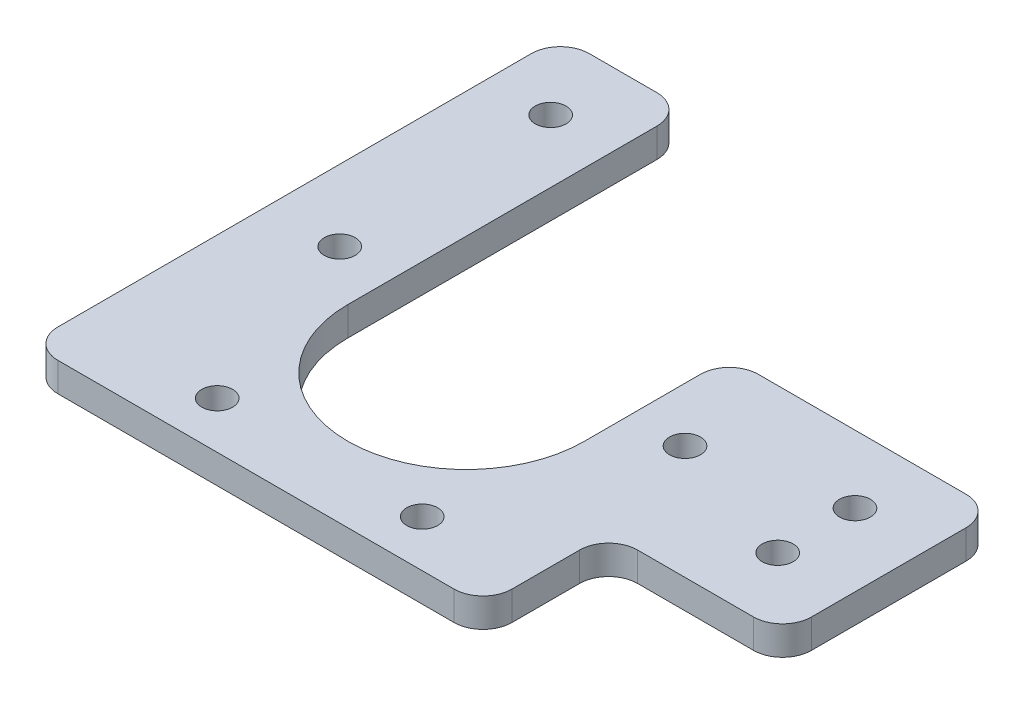
ISO-10303-21;
HEADER;
FILE_DESCRIPTION(('STEP AP214'),'2;1');
FILE_NAME('part.step','',(''),(''),'','','');
FILE_SCHEMA(('AUTOMOTIVE_DESIGN { 1 0 10303 214 1 1 1 1 }'));
ENDSEC;
DATA;
#1=APPLICATION_CONTEXT('core data for automotive mechanical design processes');
#2=APPLICATION_PROTOCOL_DEFINITION('international standard','automotive_design',2000,#1);
#3=PRODUCT_CONTEXT('',#1,'mechanical');
#4=PRODUCT('Part','Part','',(#3));
#5=PRODUCT_RELATED_PRODUCT_CATEGORY('part','',(#4));
#6=PRODUCT_DEFINITION_FORMATION('','',#4);
#7=PRODUCT_DEFINITION_CONTEXT('part definition',#1,'design');
#8=PRODUCT_DEFINITION('design','',#6,#7);
#9=PRODUCT_DEFINITION_SHAPE('','',#8);
#10=(LENGTH_UNIT() NAMED_UNIT(*) SI_UNIT(.MILLI.,.METRE.));
#11=(NAMED_UNIT(*) PLANE_ANGLE_UNIT() SI_UNIT($,.RADIAN.));
#12=(NAMED_UNIT(*) SI_UNIT($,.STERADIAN.) SOLID_ANGLE_UNIT());
#13=UNCERTAINTY_MEASURE_WITH_UNIT(LENGTH_MEASURE(1.E-05),#10,'distance_accuracy_value','');
#14=(GEOMETRIC_REPRESENTATION_CONTEXT(3) GLOBAL_UNCERTAINTY_ASSIGNED_CONTEXT((#13)) GLOBAL_UNIT_ASSIGNED_CONTEXT((#10,
#11,#12)) REPRESENTATION_CONTEXT('',''));
#15=CARTESIAN_POINT('',(0.,0.,0.));
#16=DIRECTION('',(0.,0.,1.));
#17=DIRECTION('',(1.,0.,0.));
#18=AXIS2_PLACEMENT_3D('',#15,#16,#17);
#19=CARTESIAN_POINT('',(-4.74999999999999,3.,-37.5));
#20=DIRECTION('',(0.,1.,0.));
#21=DIRECTION('',(0.,0.,1.));
#22=AXIS2_PLACEMENT_3D('',#19,#20,#21);
#23=PLANE('',#22);
#24=CARTESIAN_POINT('',(5.86116407249438,3.,-22.3456871806537));
#25=DIRECTION('',(0.,1.,0.));
#26=DIRECTION('',(0.,0.,1.));
#27=AXIS2_PLACEMENT_3D('',#24,#25,#26);
#28=CIRCLE('',#27,1.6);
#29=CARTESIAN_POINT('',(5.86116407249438,3.,-20.7456871806537));
#30=VERTEX_POINT('',#29);
#31=EDGE_CURVE('E636',#30,#30,#28,.T.);
#32=ORIENTED_EDGE('',*,*,#31,.F.);
#33=EDGE_LOOP('',(#32));
#34=FACE_BOUND('',#33,.T.);
#35=CARTESIAN_POINT('',(-15.3611640724944,3.,-22.3456871806537));
#36=DIRECTION('',(0.,1.,0.));
#37=DIRECTION('',(0.,0.,-1.));
#38=AXIS2_PLACEMENT_3D('',#35,#36,#37);
#39=CIRCLE('',#38,1.6);
#40=CARTESIAN_POINT('',(-15.3611640724944,3.,-23.9456871806537));
#41=VERTEX_POINT('',#40);
#42=EDGE_CURVE('E624',#41,#41,#39,.T.);
#43=ORIENTED_EDGE('',*,*,#42,.F.);
#44=EDGE_LOOP('',(#43));
#45=FACE_BOUND('',#44,.T.);
#46=CARTESIAN_POINT('',(27.5,3.,-45.5));
#47=DIRECTION('',(0.,1.,0.));
#48=DIRECTION('',(0.,0.,1.));
#49=AXIS2_PLACEMENT_3D('',#46,#47,#48);
#50=CIRCLE('',#49,1.6);
#51=CARTESIAN_POINT('',(27.5,3.,-43.9));
#52=VERTEX_POINT('',#51);
#53=EDGE_CURVE('E611',#52,#52,#50,.T.);
#54=ORIENTED_EDGE('',*,*,#53,.F.);
#55=EDGE_LOOP('',(#54));
#56=FACE_BOUND('',#55,.T.);
#57=DIRECTION('',(0.,0.,1.));
#58=VECTOR('',#57,1.);
#59=CARTESIAN_POINT('',(-30.,3.,-72.5));
#60=LINE('',#59,#58);
#61=CARTESIAN_POINT('',(-30.,3.,-69.5));
#62=VERTEX_POINT('',#61);
#63=CARTESIAN_POINT('',(-30.,3.,-20.5));
#64=VERTEX_POINT('',#63);
#65=EDGE_CURVE('E333',#62,#64,#60,.T.);
#66=ORIENTED_EDGE('',*,*,#65,.T.);
#67=CARTESIAN_POINT('',(-27.,3.,-20.5));
#68=DIRECTION('',(0.,1.,0.));
#69=DIRECTION('',(0.,0.,1.));
#70=AXIS2_PLACEMENT_3D('',#67,#68,#69);
#71=CIRCLE('',#70,3.);
#72=CARTESIAN_POINT('',(-27.,3.,-17.5));
#73=VERTEX_POINT('',#72);
#74=EDGE_CURVE('E232',#64,#73,#71,.T.);
#75=ORIENTED_EDGE('',*,*,#74,.T.);
#76=DIRECTION('',(1.,0.,0.));
#77=VECTOR('',#76,1.);
#78=CARTESIAN_POINT('',(-30.,3.,-17.5));
#79=LINE('',#78,#77);
#80=CARTESIAN_POINT('',(14.,3.,-17.5));
#81=VERTEX_POINT('',#80);
#82=EDGE_CURVE('E296',#73,#81,#79,.T.);
#83=ORIENTED_EDGE('',*,*,#82,.T.);
#84=CARTESIAN_POINT('',(14.,3.,-20.5));
#85=DIRECTION('',(0.,1.,0.));
#86=DIRECTION('',(0.,0.,1.));
#87=AXIS2_PLACEMENT_3D('',#84,#85,#86);
#88=CIRCLE('',#87,3.);
#89=CARTESIAN_POINT('',(17.,3.,-20.5));
#90=VERTEX_POINT('',#89);
#91=EDGE_CURVE('E230',#81,#90,#88,.T.);
#92=ORIENTED_EDGE('',*,*,#91,.T.);
#93=DIRECTION('',(0.,0.,-1.));
#94=VECTOR('',#93,1.);
#95=CARTESIAN_POINT('',(17.,3.,-17.5));
#96=LINE('',#95,#94);
#97=CARTESIAN_POINT('',(17.,3.,-27.5));
#98=VERTEX_POINT('',#97);
#99=EDGE_CURVE('E287',#90,#98,#96,.T.);
#100=ORIENTED_EDGE('',*,*,#99,.T.);
#101=CARTESIAN_POINT('',(20.,3.,-27.5));
#102=DIRECTION('',(0.,1.,0.));
#103=DIRECTION('',(0.,0.,1.));
#104=AXIS2_PLACEMENT_3D('',#101,#102,#103);
#105=CIRCLE('',#104,3.);
#106=CARTESIAN_POINT('',(20.,3.,-30.5));
#107=VERTEX_POINT('',#106);
#108=EDGE_CURVE('E11',#98,#107,#105,.F.);
#109=ORIENTED_EDGE('',*,*,#108,.T.);
#110=DIRECTION('',(1.,0.,0.));
#111=VECTOR('',#110,1.);
#112=CARTESIAN_POINT('',(17.,3.,-30.5));
#113=LINE('',#112,#111);
#114=CARTESIAN_POINT('',(32.,3.,-30.5));
#115=VERTEX_POINT('',#114);
#116=EDGE_CURVE('E285',#107,#115,#113,.T.);
#117=ORIENTED_EDGE('',*,*,#116,.T.);
#118=CARTESIAN_POINT('',(32.,3.,-33.5));
#119=DIRECTION('',(0.,1.,0.));
#120=DIRECTION('',(0.,0.,1.));
#121=AXIS2_PLACEMENT_3D('',#118,#119,#120);
#122=CIRCLE('',#121,3.);
#123=CARTESIAN_POINT('',(35.,3.,-33.5));
#124=VERTEX_POINT('',#123);
#125=EDGE_CURVE('E228',#115,#124,#122,.T.);
#126=ORIENTED_EDGE('',*,*,#125,.T.);
#127=DIRECTION('',(0.,0.,-1.));
#128=VECTOR('',#127,1.);
#129=CARTESIAN_POINT('',(35.,3.,-30.5));
#130=LINE('',#129,#128);
#131=CARTESIAN_POINT('',(35.,3.,-49.5));
#132=VERTEX_POINT('',#131);
#133=EDGE_CURVE('E291',#124,#132,#130,.T.);
#134=ORIENTED_EDGE('',*,*,#133,.T.);
#135=CARTESIAN_POINT('',(32.,3.,-49.5));
#136=DIRECTION('',(0.,1.,0.));
#137=DIRECTION('',(0.,0.,1.));
#138=AXIS2_PLACEMENT_3D('',#135,#136,#137);
#139=CIRCLE('',#138,3.);
#140=CARTESIAN_POINT('',(32.,3.,-52.5));
#141=VERTEX_POINT('',#140);
#142=EDGE_CURVE('E226',#132,#141,#139,.T.);
#143=ORIENTED_EDGE('',*,*,#142,.T.);
#144=DIRECTION('',(-1.,0.,0.));
#145=VECTOR('',#144,1.);
#146=CARTESIAN_POINT('',(35.,3.,-52.5));
#147=LINE('',#146,#145);
#148=CARTESIAN_POINT('',(10.5,3.,-52.5));
#149=VERTEX_POINT('',#148);
#150=EDGE_CURVE('E294',#141,#149,#147,.T.);
#151=ORIENTED_EDGE('',*,*,#150,.T.);
#152=CARTESIAN_POINT('',(10.5,3.,-49.5));
#153=DIRECTION('',(0.,1.,0.));
#154=DIRECTION('',(0.,0.,1.));
#155=AXIS2_PLACEMENT_3D('',#152,#153,#154);
#156=CIRCLE('',#155,3.);
#157=CARTESIAN_POINT('',(7.50000000000001,3.,-49.5));
#158=VERTEX_POINT('',#157);
#159=EDGE_CURVE('E56',#149,#158,#156,.T.);
#160=ORIENTED_EDGE('',*,*,#159,.T.);
#161=DIRECTION('',(0.,0.,1.));
#162=VECTOR('',#161,1.);
#163=CARTESIAN_POINT('',(7.50000000000001,3.,-52.5));
#164=LINE('',#163,#162);
#165=CARTESIAN_POINT('',(7.50000000000001,3.,-37.5));
#166=VERTEX_POINT('',#165);
#167=EDGE_CURVE('E183',#158,#166,#164,.T.);
#168=ORIENTED_EDGE('',*,*,#167,.T.);
#169=CARTESIAN_POINT('',(-4.74999999999999,3.,-37.5));
#170=DIRECTION('',(0.,-1.,0.));
#171=DIRECTION('',(0.,0.,1.));
#172=AXIS2_PLACEMENT_3D('',#169,#170,#171);
#173=CIRCLE('',#172,12.25);
#174=CARTESIAN_POINT('',(-17.,3.,-37.5));
#175=VERTEX_POINT('',#174);
#176=EDGE_CURVE('E178',#166,#175,#173,.T.);
#177=ORIENTED_EDGE('',*,*,#176,.T.);
#178=DIRECTION('',(0.,0.,-1.));
#179=VECTOR('',#178,1.);
#180=CARTESIAN_POINT('',(-17.,3.,-57.5));
#181=LINE('',#180,#179);
#182=CARTESIAN_POINT('',(-17.,3.,-69.5));
#183=VERTEX_POINT('',#182);
#184=EDGE_CURVE('E167',#175,#183,#181,.T.);
#185=ORIENTED_EDGE('',*,*,#184,.T.);
#186=CARTESIAN_POINT('',(-20.,3.,-69.5));
#187=DIRECTION('',(0.,1.,0.));
#188=DIRECTION('',(0.,0.,1.));
#189=AXIS2_PLACEMENT_3D('',#186,#187,#188);
#190=CIRCLE('',#189,3.);
#191=CARTESIAN_POINT('',(-20.,3.,-72.5));
#192=VERTEX_POINT('',#191);
#193=EDGE_CURVE('E223',#183,#192,#190,.T.);
#194=ORIENTED_EDGE('',*,*,#193,.T.);
#195=DIRECTION('',(-1.,0.,0.));
#196=VECTOR('',#195,1.);
#197=CARTESIAN_POINT('',(-17.,3.,-72.5));
#198=LINE('',#197,#196);
#199=CARTESIAN_POINT('',(-27.,3.,-72.5));
#200=VERTEX_POINT('',#199);
#201=EDGE_CURVE('E177',#192,#200,#198,.T.);
#202=ORIENTED_EDGE('',*,*,#201,.T.);
#203=CARTESIAN_POINT('',(-27.,3.,-69.5));
#204=DIRECTION('',(0.,1.,0.));
#205=DIRECTION('',(0.,0.,1.));
#206=AXIS2_PLACEMENT_3D('',#203,#204,#205);
#207=CIRCLE('',#206,3.);
#208=EDGE_CURVE('E221',#200,#62,#207,.T.);
#209=ORIENTED_EDGE('',*,*,#208,.T.);
#210=EDGE_LOOP('',(#66,#75,#83,#92,#100,#109,#117,#126,#134,#143,#151,#160,#168,#177,#185,#194,
#202,#209));
#211=FACE_BOUND('',#210,.T.);
#212=CARTESIAN_POINT('',(-23.5,3.,-65.));
#213=DIRECTION('',(0.,1.,0.));
#214=DIRECTION('',(0.,0.,1.));
#215=AXIS2_PLACEMENT_3D('',#212,#213,#214);
#216=CIRCLE('',#215,1.6);
#217=CARTESIAN_POINT('',(-23.5,3.,-63.4));
#218=VERTEX_POINT('',#217);
#219=EDGE_CURVE('E304',#218,#218,#216,.T.);
#220=ORIENTED_EDGE('',*,*,#219,.F.);
#221=EDGE_LOOP('',(#220));
#222=FACE_BOUND('',#221,.T.);
#223=CARTESIAN_POINT('',(27.5,3.,-37.5));
#224=DIRECTION('',(0.,1.,0.));
#225=DIRECTION('',(0.,0.,1.));
#226=AXIS2_PLACEMENT_3D('',#223,#224,#225);
#227=CIRCLE('',#226,1.6);
#228=CARTESIAN_POINT('',(27.5,3.,-35.9));
#229=VERTEX_POINT('',#228);
#230=EDGE_CURVE('E619',#229,#229,#227,.T.);
#231=ORIENTED_EDGE('',*,*,#230,.F.);
#232=EDGE_LOOP('',(#231));
#233=FACE_BOUND('',#232,.T.);
#234=CARTESIAN_POINT('',(-22.6196277863477,3.,-42.2881523343967));
#235=DIRECTION('',(0.,1.,0.));
#236=DIRECTION('',(0.,0.,1.));
#237=AXIS2_PLACEMENT_3D('',#234,#235,#236);
#238=CIRCLE('',#237,1.6);
#239=CARTESIAN_POINT('',(-22.6196277863477,3.,-40.6881523343967));
#240=VERTEX_POINT('',#239);
#241=EDGE_CURVE('E630',#240,#240,#238,.T.);
#242=ORIENTED_EDGE('',*,*,#241,.F.);
#243=EDGE_LOOP('',(#242));
#244=FACE_BOUND('',#243,.T.);
#245=CARTESIAN_POINT('',(13.1196277863477,3.,-42.2881523343967));
#246=DIRECTION('',(0.,1.,0.));
#247=DIRECTION('',(0.,0.,-1.));
#248=AXIS2_PLACEMENT_3D('',#245,#246,#247);
#249=CIRCLE('',#248,1.6);
#250=CARTESIAN_POINT('',(13.1196277863477,3.,-43.8881523343967));
#251=VERTEX_POINT('',#250);
#252=EDGE_CURVE('E642',#251,#251,#249,.T.);
#253=ORIENTED_EDGE('',*,*,#252,.F.);
#254=EDGE_LOOP('',(#253));
#255=FACE_BOUND('',#254,.T.);
#256=ADVANCED_FACE('F41',(#34,#45,#56,#211,#222,#233,#244,#255),#23,.T.);
#257=CARTESIAN_POINT('',(-4.74999999999999,0.,-37.5));
#258=DIRECTION('',(0.,1.,0.));
#259=DIRECTION('',(0.,0.,1.));
#260=AXIS2_PLACEMENT_3D('',#257,#258,#259);
#261=PLANE('',#260);
#262=DIRECTION('',(1.,0.,0.));
#263=VECTOR('',#262,1.);
#264=CARTESIAN_POINT('',(-30.,0.,-17.5));
#265=LINE('',#264,#263);
#266=CARTESIAN_POINT('',(-27.,0.,-17.5));
#267=VERTEX_POINT('',#266);
#268=CARTESIAN_POINT('',(14.,0.,-17.5));
#269=VERTEX_POINT('',#268);
#270=EDGE_CURVE('E279',#267,#269,#265,.T.);
#271=ORIENTED_EDGE('',*,*,#270,.F.);
#272=CARTESIAN_POINT('',(-27.,0.,-20.5));
#273=DIRECTION('',(0.,1.,0.));
#274=DIRECTION('',(0.,0.,1.));
#275=AXIS2_PLACEMENT_3D('',#272,#273,#274);
#276=CIRCLE('',#275,3.);
#277=CARTESIAN_POINT('',(-30.,0.,-20.5));
#278=VERTEX_POINT('',#277);
#279=EDGE_CURVE('E214',#267,#278,#276,.F.);
#280=ORIENTED_EDGE('',*,*,#279,.T.);
#281=DIRECTION('',(0.,0.,1.));
#282=VECTOR('',#281,1.);
#283=CARTESIAN_POINT('',(-30.,0.,-72.5));
#284=LINE('',#283,#282);
#285=CARTESIAN_POINT('',(-30.,0.,-69.5));
#286=VERTEX_POINT('',#285);
#287=EDGE_CURVE('E309',#286,#278,#284,.T.);
#288=ORIENTED_EDGE('',*,*,#287,.F.);
#289=CARTESIAN_POINT('',(-27.,0.,-69.5));
#290=DIRECTION('',(0.,1.,0.));
#291=DIRECTION('',(0.,0.,1.));
#292=AXIS2_PLACEMENT_3D('',#289,#290,#291);
#293=CIRCLE('',#292,3.);
#294=CARTESIAN_POINT('',(-27.,0.,-72.5));
#295=VERTEX_POINT('',#294);
#296=EDGE_CURVE('E202',#286,#295,#293,.F.);
#297=ORIENTED_EDGE('',*,*,#296,.T.);
#298=DIRECTION('',(-1.,0.,0.));
#299=VECTOR('',#298,1.);
#300=CARTESIAN_POINT('',(-17.,0.,-72.5));
#301=LINE('',#300,#299);
#302=CARTESIAN_POINT('',(-20.,0.,-72.5));
#303=VERTEX_POINT('',#302);
#304=EDGE_CURVE('E306',#303,#295,#301,.T.);
#305=ORIENTED_EDGE('',*,*,#304,.F.);
#306=CARTESIAN_POINT('',(-20.,0.,-69.5));
#307=DIRECTION('',(0.,1.,0.));
#308=DIRECTION('',(0.,0.,1.));
#309=AXIS2_PLACEMENT_3D('',#306,#307,#308);
#310=CIRCLE('',#309,3.);
#311=CARTESIAN_POINT('',(-17.,0.,-69.5));
#312=VERTEX_POINT('',#311);
#313=EDGE_CURVE('E204',#303,#312,#310,.F.);
#314=ORIENTED_EDGE('',*,*,#313,.T.);
#315=DIRECTION('',(0.,0.,-1.));
#316=VECTOR('',#315,1.);
#317=CARTESIAN_POINT('',(-17.,0.,-57.5));
#318=LINE('',#317,#316);
#319=CARTESIAN_POINT('',(-17.,0.,-37.5));
#320=VERTEX_POINT('',#319);
#321=EDGE_CURVE('E303',#320,#312,#318,.T.);
#322=ORIENTED_EDGE('',*,*,#321,.F.);
#323=CARTESIAN_POINT('',(-4.74999999999999,0.,-37.5));
#324=DIRECTION('',(0.,-1.,0.));
#325=DIRECTION('',(0.,0.,1.));
#326=AXIS2_PLACEMENT_3D('',#323,#324,#325);
#327=CIRCLE('',#326,12.25);
#328=CARTESIAN_POINT('',(7.50000000000001,0.,-37.5));
#329=VERTEX_POINT('',#328);
#330=EDGE_CURVE('E191',#329,#320,#327,.T.);
#331=ORIENTED_EDGE('',*,*,#330,.F.);
#332=DIRECTION('',(0.,0.,1.));
#333=VECTOR('',#332,1.);
#334=CARTESIAN_POINT('',(7.50000000000001,0.,-52.5));
#335=LINE('',#334,#333);
#336=CARTESIAN_POINT('',(7.50000000000001,0.,-49.5));
#337=VERTEX_POINT('',#336);
#338=EDGE_CURVE('E187',#337,#329,#335,.T.);
#339=ORIENTED_EDGE('',*,*,#338,.F.);
#340=CARTESIAN_POINT('',(10.5,0.,-49.5));
#341=DIRECTION('',(0.,1.,0.));
#342=DIRECTION('',(0.,0.,1.));
#343=AXIS2_PLACEMENT_3D('',#340,#341,#342);
#344=CIRCLE('',#343,3.);
#345=CARTESIAN_POINT('',(10.5,0.,-52.5));
#346=VERTEX_POINT('',#345);
#347=EDGE_CURVE('E206',#337,#346,#344,.F.);
#348=ORIENTED_EDGE('',*,*,#347,.T.);
#349=DIRECTION('',(-1.,0.,0.));
#350=VECTOR('',#349,1.);
#351=CARTESIAN_POINT('',(35.,0.,-52.5));
#352=LINE('',#351,#350);
#353=CARTESIAN_POINT('',(32.,0.,-52.5));
#354=VERTEX_POINT('',#353);
#355=EDGE_CURVE('E318',#354,#346,#352,.T.);
#356=ORIENTED_EDGE('',*,*,#355,.F.);
#357=CARTESIAN_POINT('',(32.,0.,-49.5));
#358=DIRECTION('',(0.,1.,0.));
#359=DIRECTION('',(0.,0.,1.));
#360=AXIS2_PLACEMENT_3D('',#357,#358,#359);
#361=CIRCLE('',#360,3.);
#362=CARTESIAN_POINT('',(35.,0.,-49.5));
#363=VERTEX_POINT('',#362);
#364=EDGE_CURVE('E208',#354,#363,#361,.F.);
#365=ORIENTED_EDGE('',*,*,#364,.T.);
#366=DIRECTION('',(0.,0.,-1.));
#367=VECTOR('',#366,1.);
#368=CARTESIAN_POINT('',(35.,0.,-30.5));
#369=LINE('',#368,#367);
#370=CARTESIAN_POINT('',(35.,0.,-33.5));
#371=VERTEX_POINT('',#370);
#372=EDGE_CURVE('E315',#371,#363,#369,.T.);
#373=ORIENTED_EDGE('',*,*,#372,.F.);
#374=CARTESIAN_POINT('',(32.,0.,-33.5));
#375=DIRECTION('',(0.,1.,0.));
#376=DIRECTION('',(0.,0.,1.));
#377=AXIS2_PLACEMENT_3D('',#374,#375,#376);
#378=CIRCLE('',#377,3.);
#379=CARTESIAN_POINT('',(32.,0.,-30.5));
#380=VERTEX_POINT('',#379);
#381=EDGE_CURVE('E210',#371,#380,#378,.F.);
#382=ORIENTED_EDGE('',*,*,#381,.T.);
#383=DIRECTION('',(1.,0.,0.));
#384=VECTOR('',#383,1.);
#385=CARTESIAN_POINT('',(17.,0.,-30.5));
#386=LINE('',#385,#384);
#387=CARTESIAN_POINT('',(20.,0.,-30.5));
#388=VERTEX_POINT('',#387);
#389=EDGE_CURVE('E270',#388,#380,#386,.T.);
#390=ORIENTED_EDGE('',*,*,#389,.F.);
#391=CARTESIAN_POINT('',(20.,0.,-27.5));
#392=DIRECTION('',(0.,1.,0.));
#393=DIRECTION('',(0.,0.,1.));
#394=AXIS2_PLACEMENT_3D('',#391,#392,#393);
#395=CIRCLE('',#394,3.);
#396=CARTESIAN_POINT('',(17.,0.,-27.5));
#397=VERTEX_POINT('',#396);
#398=EDGE_CURVE('E49',#388,#397,#395,.T.);
#399=ORIENTED_EDGE('',*,*,#398,.T.);
#400=DIRECTION('',(0.,0.,-1.));
#401=VECTOR('',#400,1.);
#402=CARTESIAN_POINT('',(17.,0.,-17.5));
#403=LINE('',#402,#401);
#404=CARTESIAN_POINT('',(17.,0.,-20.5));
#405=VERTEX_POINT('',#404);
#406=EDGE_CURVE('E268',#405,#397,#403,.T.);
#407=ORIENTED_EDGE('',*,*,#406,.F.);
#408=CARTESIAN_POINT('',(14.,0.,-20.5));
#409=DIRECTION('',(0.,1.,0.));
#410=DIRECTION('',(0.,0.,1.));
#411=AXIS2_PLACEMENT_3D('',#408,#409,#410);
#412=CIRCLE('',#411,3.);
#413=EDGE_CURVE('E212',#405,#269,#412,.F.);
#414=ORIENTED_EDGE('',*,*,#413,.T.);
#415=EDGE_LOOP('',(#271,#280,#288,#297,#305,#314,#322,#331,#339,#348,#356,#365,#373,#382,#390,
#399,#407,#414));
#416=FACE_BOUND('',#415,.T.);
#417=CARTESIAN_POINT('',(-23.5,0.,-65.));
#418=DIRECTION('',(0.,1.,0.));
#419=DIRECTION('',(0.,0.,1.));
#420=AXIS2_PLACEMENT_3D('',#417,#418,#419);
#421=CIRCLE('',#420,1.6);
#422=CARTESIAN_POINT('',(-23.5,0.,-63.4));
#423=VERTEX_POINT('',#422);
#424=EDGE_CURVE('E610',#423,#423,#421,.T.);
#425=ORIENTED_EDGE('',*,*,#424,.T.);
#426=EDGE_LOOP('',(#425));
#427=FACE_BOUND('',#426,.T.);
#428=CARTESIAN_POINT('',(27.5,0.,-45.5));
#429=DIRECTION('',(0.,1.,0.));
#430=DIRECTION('',(0.,0.,1.));
#431=AXIS2_PLACEMENT_3D('',#428,#429,#430);
#432=CIRCLE('',#431,1.6);
#433=CARTESIAN_POINT('',(27.5,0.,-43.9));
#434=VERTEX_POINT('',#433);
#435=EDGE_CURVE('E615',#434,#434,#432,.T.);
#436=ORIENTED_EDGE('',*,*,#435,.T.);
#437=EDGE_LOOP('',(#436));
#438=FACE_BOUND('',#437,.T.);
#439=CARTESIAN_POINT('',(27.5,0.,-37.5));
#440=DIRECTION('',(0.,1.,0.));
#441=DIRECTION('',(0.,0.,1.));
#442=AXIS2_PLACEMENT_3D('',#439,#440,#441);
#443=CIRCLE('',#442,1.6);
#444=CARTESIAN_POINT('',(27.5,0.,-35.9));
#445=VERTEX_POINT('',#444);
#446=EDGE_CURVE('E621',#445,#445,#443,.T.);
#447=ORIENTED_EDGE('',*,*,#446,.T.);
#448=EDGE_LOOP('',(#447));
#449=FACE_BOUND('',#448,.T.);
#450=CARTESIAN_POINT('',(-15.3611640724944,0.,-22.3456871806537));
#451=DIRECTION('',(0.,1.,0.));
#452=DIRECTION('',(0.,0.,-1.));
#453=AXIS2_PLACEMENT_3D('',#450,#451,#452);
#454=CIRCLE('',#453,1.6);
#455=CARTESIAN_POINT('',(-15.3611640724944,0.,-23.9456871806537));
#456=VERTEX_POINT('',#455);
#457=EDGE_CURVE('E627',#456,#456,#454,.T.);
#458=ORIENTED_EDGE('',*,*,#457,.T.);
#459=EDGE_LOOP('',(#458));
#460=FACE_BOUND('',#459,.T.);
#461=CARTESIAN_POINT('',(-22.6196277863477,0.,-42.2881523343967));
#462=DIRECTION('',(0.,1.,0.));
#463=DIRECTION('',(0.,0.,1.));
#464=AXIS2_PLACEMENT_3D('',#461,#462,#463);
#465=CIRCLE('',#464,1.6);
#466=CARTESIAN_POINT('',(-22.6196277863477,0.,-40.6881523343967));
#467=VERTEX_POINT('',#466);
#468=EDGE_CURVE('E633',#467,#467,#465,.T.);
#469=ORIENTED_EDGE('',*,*,#468,.T.);
#470=EDGE_LOOP('',(#469));
#471=FACE_BOUND('',#470,.T.);
#472=CARTESIAN_POINT('',(5.86116407249438,0.,-22.3456871806537));
#473=DIRECTION('',(0.,1.,0.));
#474=DIRECTION('',(0.,0.,1.));
#475=AXIS2_PLACEMENT_3D('',#472,#473,#474);
#476=CIRCLE('',#475,1.6);
#477=CARTESIAN_POINT('',(5.86116407249438,0.,-20.7456871806537));
#478=VERTEX_POINT('',#477);
#479=EDGE_CURVE('E639',#478,#478,#476,.T.);
#480=ORIENTED_EDGE('',*,*,#479,.T.);
#481=EDGE_LOOP('',(#480));
#482=FACE_BOUND('',#481,.T.);
#483=CARTESIAN_POINT('',(13.1196277863477,0.,-42.2881523343967));
#484=DIRECTION('',(0.,1.,0.));
#485=DIRECTION('',(0.,0.,-1.));
#486=AXIS2_PLACEMENT_3D('',#483,#484,#485);
#487=CIRCLE('',#486,1.6);
#488=CARTESIAN_POINT('',(13.1196277863477,0.,-43.8881523343967));
#489=VERTEX_POINT('',#488);
#490=EDGE_CURVE('E645',#489,#489,#487,.T.);
#491=ORIENTED_EDGE('',*,*,#490,.T.);
#492=EDGE_LOOP('',(#491));
#493=FACE_BOUND('',#492,.T.);
#494=ADVANCED_FACE('F266',(#416,#427,#438,#449,#460,#471,#482,#493),#261,.F.);
#495=CARTESIAN_POINT('',(-4.74999999999999,3.,-37.5));
#496=DIRECTION('',(0.,-1.,0.));
#497=DIRECTION('',(0.,0.,-1.));
#498=AXIS2_PLACEMENT_3D('',#495,#496,#497);
#499=CYLINDRICAL_SURFACE('',#498,12.25);
#500=ORIENTED_EDGE('',*,*,#330,.T.);
#501=DIRECTION('',(0.,-1.,0.));
#502=VECTOR('',#501,1.);
#503=CARTESIAN_POINT('',(-17.,3.,-37.5));
#504=LINE('',#503,#502);
#505=EDGE_CURVE('E172',#175,#320,#504,.T.);
#506=ORIENTED_EDGE('',*,*,#505,.F.);
#507=ORIENTED_EDGE('',*,*,#176,.F.);
#508=DIRECTION('',(0.,-1.,0.));
#509=VECTOR('',#508,1.);
#510=CARTESIAN_POINT('',(7.50000000000001,3.,-37.5));
#511=LINE('',#510,#509);
#512=EDGE_CURVE('E193',#166,#329,#511,.T.);
#513=ORIENTED_EDGE('',*,*,#512,.T.);
#514=EDGE_LOOP('',(#500,#506,#507,#513));
#515=FACE_BOUND('',#514,.T.);
#516=ADVANCED_FACE('F189',(#515),#499,.F.);
#517=CARTESIAN_POINT('',(-17.,3.,-57.5));
#518=DIRECTION('',(-1.,0.,0.));
#519=DIRECTION('',(0.,0.,1.));
#520=AXIS2_PLACEMENT_3D('',#517,#518,#519);
#521=PLANE('',#520);
#522=ORIENTED_EDGE('',*,*,#321,.T.);
#523=DIRECTION('',(0.,-1.,0.));
#524=VECTOR('',#523,1.);
#525=CARTESIAN_POINT('',(-17.,3.,-69.5));
#526=LINE('',#525,#524);
#527=EDGE_CURVE('E175',#312,#183,#526,.F.);
#528=ORIENTED_EDGE('',*,*,#527,.T.);
#529=ORIENTED_EDGE('',*,*,#184,.F.);
#530=ORIENTED_EDGE('',*,*,#505,.T.);
#531=EDGE_LOOP('',(#522,#528,#529,#530));
#532=FACE_BOUND('',#531,.T.);
#533=ADVANCED_FACE('F170',(#532),#521,.F.);
#534=CARTESIAN_POINT('',(-17.,3.,-72.5));
#535=DIRECTION('',(0.,0.,1.));
#536=DIRECTION('',(1.,0.,0.));
#537=AXIS2_PLACEMENT_3D('',#534,#535,#536);
#538=PLANE('',#537);
#539=ORIENTED_EDGE('',*,*,#201,.F.);
#540=DIRECTION('',(0.,-1.,0.));
#541=VECTOR('',#540,1.);
#542=CARTESIAN_POINT('',(-20.,3.,-72.5));
#543=LINE('',#542,#541);
#544=EDGE_CURVE('E258',#192,#303,#543,.T.);
#545=ORIENTED_EDGE('',*,*,#544,.T.);
#546=ORIENTED_EDGE('',*,*,#304,.T.);
#547=DIRECTION('',(0.,-1.,0.));
#548=VECTOR('',#547,1.);
#549=CARTESIAN_POINT('',(-27.,3.,-72.5));
#550=LINE('',#549,#548);
#551=EDGE_CURVE('E256',#295,#200,#550,.F.);
#552=ORIENTED_EDGE('',*,*,#551,.T.);
#553=EDGE_LOOP('',(#539,#545,#546,#552));
#554=FACE_BOUND('',#553,.T.);
#555=ADVANCED_FACE('F331',(#554),#538,.F.);
#556=CARTESIAN_POINT('',(-30.,3.,-72.5));
#557=DIRECTION('',(1.,0.,0.));
#558=DIRECTION('',(0.,0.,-1.));
#559=AXIS2_PLACEMENT_3D('',#556,#557,#558);
#560=PLANE('',#559);
#561=ORIENTED_EDGE('',*,*,#287,.T.);
#562=DIRECTION('',(0.,-1.,0.));
#563=VECTOR('',#562,1.);
#564=CARTESIAN_POINT('',(-30.,3.,-20.5));
#565=LINE('',#564,#563);
#566=EDGE_CURVE('E219',#278,#64,#565,.F.);
#567=ORIENTED_EDGE('',*,*,#566,.T.);
#568=ORIENTED_EDGE('',*,*,#65,.F.);
#569=DIRECTION('',(0.,-1.,0.));
#570=VECTOR('',#569,1.);
#571=CARTESIAN_POINT('',(-30.,3.,-69.5));
#572=LINE('',#571,#570);
#573=EDGE_CURVE('E216',#62,#286,#572,.T.);
#574=ORIENTED_EDGE('',*,*,#573,.T.);
#575=EDGE_LOOP('',(#561,#567,#568,#574));
#576=FACE_BOUND('',#575,.T.);
#577=ADVANCED_FACE('F351',(#576),#560,.F.);
#578=CARTESIAN_POINT('',(-30.,3.,-17.5));
#579=DIRECTION('',(0.,0.,-1.));
#580=DIRECTION('',(-1.,0.,0.));
#581=AXIS2_PLACEMENT_3D('',#578,#579,#580);
#582=PLANE('',#581);
#583=ORIENTED_EDGE('',*,*,#82,.F.);
#584=DIRECTION('',(0.,-1.,0.));
#585=VECTOR('',#584,1.);
#586=CARTESIAN_POINT('',(-27.,3.,-17.5));
#587=LINE('',#586,#585);
#588=EDGE_CURVE('E195',#73,#267,#587,.T.);
#589=ORIENTED_EDGE('',*,*,#588,.T.);
#590=ORIENTED_EDGE('',*,*,#270,.T.);
#591=DIRECTION('',(0.,-1.,0.));
#592=VECTOR('',#591,1.);
#593=CARTESIAN_POINT('',(14.,3.,-17.5));
#594=LINE('',#593,#592);
#595=EDGE_CURVE('E192',#269,#81,#594,.F.);
#596=ORIENTED_EDGE('',*,*,#595,.T.);
#597=EDGE_LOOP('',(#583,#589,#590,#596));
#598=FACE_BOUND('',#597,.T.);
#599=ADVANCED_FACE('F345',(#598),#582,.F.);
#600=CARTESIAN_POINT('',(17.,3.,-17.5));
#601=DIRECTION('',(-1.,0.,0.));
#602=DIRECTION('',(0.,0.,1.));
#603=AXIS2_PLACEMENT_3D('',#600,#601,#602);
#604=PLANE('',#603);
#605=ORIENTED_EDGE('',*,*,#99,.F.);
#606=DIRECTION('',(0.,-1.,0.));
#607=VECTOR('',#606,1.);
#608=CARTESIAN_POINT('',(17.,3.,-20.5));
#609=LINE('',#608,#607);
#610=EDGE_CURVE('E236',#90,#405,#609,.T.);
#611=ORIENTED_EDGE('',*,*,#610,.T.);
#612=ORIENTED_EDGE('',*,*,#406,.T.);
#613=DIRECTION('',(0.,-1.,0.));
#614=VECTOR('',#613,1.);
#615=CARTESIAN_POINT('',(17.,3.,-27.5));
#616=LINE('',#615,#614);
#617=EDGE_CURVE('E234',#397,#98,#616,.F.);
#618=ORIENTED_EDGE('',*,*,#617,.T.);
#619=EDGE_LOOP('',(#605,#611,#612,#618));
#620=FACE_BOUND('',#619,.T.);
#621=ADVANCED_FACE('F276',(#620),#604,.F.);
#622=CARTESIAN_POINT('',(17.,3.,-30.5));
#623=DIRECTION('',(0.,0.,-1.));
#624=DIRECTION('',(-1.,0.,0.));
#625=AXIS2_PLACEMENT_3D('',#622,#623,#624);
#626=PLANE('',#625);
#627=ORIENTED_EDGE('',*,*,#116,.F.);
#628=DIRECTION('',(0.,-1.,0.));
#629=VECTOR('',#628,1.);
#630=CARTESIAN_POINT('',(20.,0.,-30.5));
#631=LINE('',#630,#629);
#632=EDGE_CURVE('E241',#107,#388,#631,.T.);
#633=ORIENTED_EDGE('',*,*,#632,.T.);
#634=ORIENTED_EDGE('',*,*,#389,.T.);
#635=DIRECTION('',(0.,-1.,0.));
#636=VECTOR('',#635,1.);
#637=CARTESIAN_POINT('',(32.,3.,-30.5));
#638=LINE('',#637,#636);
#639=EDGE_CURVE('E239',#380,#115,#638,.F.);
#640=ORIENTED_EDGE('',*,*,#639,.T.);
#641=EDGE_LOOP('',(#627,#633,#634,#640));
#642=FACE_BOUND('',#641,.T.);
#643=ADVANCED_FACE('F289',(#642),#626,.F.);
#644=CARTESIAN_POINT('',(35.,3.,-30.5));
#645=DIRECTION('',(-1.,0.,0.));
#646=DIRECTION('',(0.,0.,1.));
#647=AXIS2_PLACEMENT_3D('',#644,#645,#646);
#648=PLANE('',#647);
#649=ORIENTED_EDGE('',*,*,#133,.F.);
#650=DIRECTION('',(0.,-1.,0.));
#651=VECTOR('',#650,1.);
#652=CARTESIAN_POINT('',(35.,3.,-33.5));
#653=LINE('',#652,#651);
#654=EDGE_CURVE('E246',#124,#371,#653,.T.);
#655=ORIENTED_EDGE('',*,*,#654,.T.);
#656=ORIENTED_EDGE('',*,*,#372,.T.);
#657=DIRECTION('',(0.,-1.,0.));
#658=VECTOR('',#657,1.);
#659=CARTESIAN_POINT('',(35.,3.,-49.5));
#660=LINE('',#659,#658);
#661=EDGE_CURVE('E244',#363,#132,#660,.F.);
#662=ORIENTED_EDGE('',*,*,#661,.T.);
#663=EDGE_LOOP('',(#649,#655,#656,#662));
#664=FACE_BOUND('',#663,.T.);
#665=ADVANCED_FACE('F379',(#664),#648,.F.);
#666=CARTESIAN_POINT('',(35.,3.,-52.5));
#667=DIRECTION('',(0.,0.,1.));
#668=DIRECTION('',(1.,0.,0.));
#669=AXIS2_PLACEMENT_3D('',#666,#667,#668);
#670=PLANE('',#669);
#671=ORIENTED_EDGE('',*,*,#150,.F.);
#672=DIRECTION('',(0.,-1.,0.));
#673=VECTOR('',#672,1.);
#674=CARTESIAN_POINT('',(32.,3.,-52.5));
#675=LINE('',#674,#673);
#676=EDGE_CURVE('E250',#141,#354,#675,.T.);
#677=ORIENTED_EDGE('',*,*,#676,.T.);
#678=ORIENTED_EDGE('',*,*,#355,.T.);
#679=DIRECTION('',(0.,-1.,0.));
#680=VECTOR('',#679,1.);
#681=CARTESIAN_POINT('',(10.5,3.,-52.5));
#682=LINE('',#681,#680);
#683=EDGE_CURVE('E64',#346,#149,#682,.F.);
#684=ORIENTED_EDGE('',*,*,#683,.T.);
#685=EDGE_LOOP('',(#671,#677,#678,#684));
#686=FACE_BOUND('',#685,.T.);
#687=ADVANCED_FACE('F376',(#686),#670,.F.);
#688=CARTESIAN_POINT('',(7.50000000000001,3.,-52.5));
#689=DIRECTION('',(1.,0.,0.));
#690=DIRECTION('',(0.,0.,-1.));
#691=AXIS2_PLACEMENT_3D('',#688,#689,#690);
#692=PLANE('',#691);
#693=ORIENTED_EDGE('',*,*,#167,.F.);
#694=DIRECTION('',(0.,-1.,0.));
#695=VECTOR('',#694,1.);
#696=CARTESIAN_POINT('',(7.50000000000001,3.,-49.5));
#697=LINE('',#696,#695);
#698=EDGE_CURVE('E253',#158,#337,#697,.T.);
#699=ORIENTED_EDGE('',*,*,#698,.T.);
#700=ORIENTED_EDGE('',*,*,#338,.T.);
#701=ORIENTED_EDGE('',*,*,#512,.F.);
#702=EDGE_LOOP('',(#693,#699,#700,#701));
#703=FACE_BOUND('',#702,.T.);
#704=ADVANCED_FACE('F321',(#703),#692,.F.);
#705=CARTESIAN_POINT('',(-23.5,3.,-65.));
#706=DIRECTION('',(0.,-1.,0.));
#707=DIRECTION('',(0.,0.,-1.));
#708=AXIS2_PLACEMENT_3D('',#705,#706,#707);
#709=CYLINDRICAL_SURFACE('',#708,1.6);
#710=ORIENTED_EDGE('',*,*,#219,.T.);
#711=EDGE_LOOP('',(#710));
#712=FACE_BOUND('',#711,.T.);
#713=ORIENTED_EDGE('',*,*,#424,.F.);
#714=EDGE_LOOP('',(#713));
#715=FACE_BOUND('',#714,.T.);
#716=ADVANCED_FACE('F371',(#712,#715),#709,.F.);
#717=CARTESIAN_POINT('',(27.5,3.,-45.5));
#718=DIRECTION('',(0.,-1.,0.));
#719=DIRECTION('',(0.,0.,-1.));
#720=AXIS2_PLACEMENT_3D('',#717,#718,#719);
#721=CYLINDRICAL_SURFACE('',#720,1.6);
#722=ORIENTED_EDGE('',*,*,#53,.T.);
#723=EDGE_LOOP('',(#722));
#724=FACE_BOUND('',#723,.T.);
#725=ORIENTED_EDGE('',*,*,#435,.F.);
#726=EDGE_LOOP('',(#725));
#727=FACE_BOUND('',#726,.T.);
#728=ADVANCED_FACE('F503',(#724,#727),#721,.F.);
#729=CARTESIAN_POINT('',(27.5,3.,-37.5));
#730=DIRECTION('',(0.,-1.,0.));
#731=DIRECTION('',(0.,0.,-1.));
#732=AXIS2_PLACEMENT_3D('',#729,#730,#731);
#733=CYLINDRICAL_SURFACE('',#732,1.6);
#734=ORIENTED_EDGE('',*,*,#230,.T.);
#735=EDGE_LOOP('',(#734));
#736=FACE_BOUND('',#735,.T.);
#737=ORIENTED_EDGE('',*,*,#446,.F.);
#738=EDGE_LOOP('',(#737));
#739=FACE_BOUND('',#738,.T.);
#740=ADVANCED_FACE('F494',(#736,#739),#733,.F.);
#741=CARTESIAN_POINT('',(-15.3611640724944,3.,-22.3456871806537));
#742=DIRECTION('',(0.,-1.,0.));
#743=DIRECTION('',(0.,0.,-1.));
#744=AXIS2_PLACEMENT_3D('',#741,#742,#743);
#745=CYLINDRICAL_SURFACE('',#744,1.6);
#746=ORIENTED_EDGE('',*,*,#42,.T.);
#747=EDGE_LOOP('',(#746));
#748=FACE_BOUND('',#747,.T.);
#749=ORIENTED_EDGE('',*,*,#457,.F.);
#750=EDGE_LOOP('',(#749));
#751=FACE_BOUND('',#750,.T.);
#752=ADVANCED_FACE('F485',(#748,#751),#745,.F.);
#753=CARTESIAN_POINT('',(-22.6196277863477,3.,-42.2881523343967));
#754=DIRECTION('',(0.,-1.,0.));
#755=DIRECTION('',(0.,0.,-1.));
#756=AXIS2_PLACEMENT_3D('',#753,#754,#755);
#757=CYLINDRICAL_SURFACE('',#756,1.6);
#758=ORIENTED_EDGE('',*,*,#241,.T.);
#759=EDGE_LOOP('',(#758));
#760=FACE_BOUND('',#759,.T.);
#761=ORIENTED_EDGE('',*,*,#468,.F.);
#762=EDGE_LOOP('',(#761));
#763=FACE_BOUND('',#762,.T.);
#764=ADVANCED_FACE('F476',(#760,#763),#757,.F.);
#765=CARTESIAN_POINT('',(5.86116407249438,3.,-22.3456871806537));
#766=DIRECTION('',(0.,-1.,0.));
#767=DIRECTION('',(0.,0.,-1.));
#768=AXIS2_PLACEMENT_3D('',#765,#766,#767);
#769=CYLINDRICAL_SURFACE('',#768,1.6);
#770=ORIENTED_EDGE('',*,*,#31,.T.);
#771=EDGE_LOOP('',(#770));
#772=FACE_BOUND('',#771,.T.);
#773=ORIENTED_EDGE('',*,*,#479,.F.);
#774=EDGE_LOOP('',(#773));
#775=FACE_BOUND('',#774,.T.);
#776=ADVANCED_FACE('F467',(#772,#775),#769,.F.);
#777=CARTESIAN_POINT('',(13.1196277863477,3.,-42.2881523343967));
#778=DIRECTION('',(0.,-1.,0.));
#779=DIRECTION('',(0.,0.,-1.));
#780=AXIS2_PLACEMENT_3D('',#777,#778,#779);
#781=CYLINDRICAL_SURFACE('',#780,1.6);
#782=ORIENTED_EDGE('',*,*,#252,.T.);
#783=EDGE_LOOP('',(#782));
#784=FACE_BOUND('',#783,.T.);
#785=ORIENTED_EDGE('',*,*,#490,.F.);
#786=EDGE_LOOP('',(#785));
#787=FACE_BOUND('',#786,.T.);
#788=ADVANCED_FACE('F399',(#784,#787),#781,.F.);
#789=CARTESIAN_POINT('',(-27.,3.,-20.5));
#790=DIRECTION('',(0.,-1.,0.));
#791=DIRECTION('',(0.,0.,-1.));
#792=AXIS2_PLACEMENT_3D('',#789,#790,#791);
#793=CYLINDRICAL_SURFACE('',#792,3.);
#794=ORIENTED_EDGE('',*,*,#74,.F.);
#795=ORIENTED_EDGE('',*,*,#566,.F.);
#796=ORIENTED_EDGE('',*,*,#279,.F.);
#797=ORIENTED_EDGE('',*,*,#588,.F.);
#798=EDGE_LOOP('',(#794,#795,#796,#797));
#799=FACE_BOUND('',#798,.T.);
#800=ADVANCED_FACE('F347',(#799),#793,.T.);
#801=CARTESIAN_POINT('',(14.,3.,-20.5));
#802=DIRECTION('',(0.,-1.,0.));
#803=DIRECTION('',(0.,0.,-1.));
#804=AXIS2_PLACEMENT_3D('',#801,#802,#803);
#805=CYLINDRICAL_SURFACE('',#804,3.);
#806=ORIENTED_EDGE('',*,*,#91,.F.);
#807=ORIENTED_EDGE('',*,*,#595,.F.);
#808=ORIENTED_EDGE('',*,*,#413,.F.);
#809=ORIENTED_EDGE('',*,*,#610,.F.);
#810=EDGE_LOOP('',(#806,#807,#808,#809));
#811=FACE_BOUND('',#810,.T.);
#812=ADVANCED_FACE('F344',(#811),#805,.T.);
#813=CARTESIAN_POINT('',(20.,3.,-27.5));
#814=DIRECTION('',(0.,1.,0.));
#815=DIRECTION('',(0.,0.,1.));
#816=AXIS2_PLACEMENT_3D('',#813,#814,#815);
#817=CYLINDRICAL_SURFACE('',#816,3.);
#818=ORIENTED_EDGE('',*,*,#108,.F.);
#819=ORIENTED_EDGE('',*,*,#617,.F.);
#820=ORIENTED_EDGE('',*,*,#398,.F.);
#821=ORIENTED_EDGE('',*,*,#632,.F.);
#822=EDGE_LOOP('',(#818,#819,#820,#821));
#823=FACE_BOUND('',#822,.T.);
#824=ADVANCED_FACE('F282',(#823),#817,.F.);
#825=CARTESIAN_POINT('',(32.,3.,-33.5));
#826=DIRECTION('',(0.,-1.,0.));
#827=DIRECTION('',(0.,0.,-1.));
#828=AXIS2_PLACEMENT_3D('',#825,#826,#827);
#829=CYLINDRICAL_SURFACE('',#828,3.);
#830=ORIENTED_EDGE('',*,*,#125,.F.);
#831=ORIENTED_EDGE('',*,*,#639,.F.);
#832=ORIENTED_EDGE('',*,*,#381,.F.);
#833=ORIENTED_EDGE('',*,*,#654,.F.);
#834=EDGE_LOOP('',(#830,#831,#832,#833));
#835=FACE_BOUND('',#834,.T.);
#836=ADVANCED_FACE('F404',(#835),#829,.T.);
#837=CARTESIAN_POINT('',(32.,3.,-49.5));
#838=DIRECTION('',(0.,-1.,0.));
#839=DIRECTION('',(0.,0.,-1.));
#840=AXIS2_PLACEMENT_3D('',#837,#838,#839);
#841=CYLINDRICAL_SURFACE('',#840,3.);
#842=ORIENTED_EDGE('',*,*,#142,.F.);
#843=ORIENTED_EDGE('',*,*,#661,.F.);
#844=ORIENTED_EDGE('',*,*,#364,.F.);
#845=ORIENTED_EDGE('',*,*,#676,.F.);
#846=EDGE_LOOP('',(#842,#843,#844,#845));
#847=FACE_BOUND('',#846,.T.);
#848=ADVANCED_FACE('F407',(#847),#841,.T.);
#849=CARTESIAN_POINT('',(10.5,3.,-49.5));
#850=DIRECTION('',(0.,-1.,0.));
#851=DIRECTION('',(0.,0.,-1.));
#852=AXIS2_PLACEMENT_3D('',#849,#850,#851);
#853=CYLINDRICAL_SURFACE('',#852,3.);
#854=ORIENTED_EDGE('',*,*,#159,.F.);
#855=ORIENTED_EDGE('',*,*,#683,.F.);
#856=ORIENTED_EDGE('',*,*,#347,.F.);
#857=ORIENTED_EDGE('',*,*,#698,.F.);
#858=EDGE_LOOP('',(#854,#855,#856,#857));
#859=FACE_BOUND('',#858,.T.);
#860=ADVANCED_FACE('F359',(#859),#853,.T.);
#861=CARTESIAN_POINT('',(-20.,3.,-69.5));
#862=DIRECTION('',(0.,-1.,0.));
#863=DIRECTION('',(0.,0.,-1.));
#864=AXIS2_PLACEMENT_3D('',#861,#862,#863);
#865=CYLINDRICAL_SURFACE('',#864,3.);
#866=ORIENTED_EDGE('',*,*,#193,.F.);
#867=ORIENTED_EDGE('',*,*,#527,.F.);
#868=ORIENTED_EDGE('',*,*,#313,.F.);
#869=ORIENTED_EDGE('',*,*,#544,.F.);
#870=EDGE_LOOP('',(#866,#867,#868,#869));
#871=FACE_BOUND('',#870,.T.);
#872=ADVANCED_FACE('F325',(#871),#865,.T.);
#873=CARTESIAN_POINT('',(-27.,3.,-69.5));
#874=DIRECTION('',(0.,-1.,0.));
#875=DIRECTION('',(0.,0.,-1.));
#876=AXIS2_PLACEMENT_3D('',#873,#874,#875);
#877=CYLINDRICAL_SURFACE('',#876,3.);
#878=ORIENTED_EDGE('',*,*,#208,.F.);
#879=ORIENTED_EDGE('',*,*,#551,.F.);
#880=ORIENTED_EDGE('',*,*,#296,.F.);
#881=ORIENTED_EDGE('',*,*,#573,.F.);
#882=EDGE_LOOP('',(#878,#879,#880,#881));
#883=FACE_BOUND('',#882,.T.);
#884=ADVANCED_FACE('F43',(#883),#877,.T.);
#885=CLOSED_SHELL('',(#256,#494,#516,#533,#555,#577,#599,#621,#643,#665,#687,#704,#716,#728,
#740,#752,#764,#776,#788,#800,#812,#824,#836,#848,#860,#872,#884));
#886=MANIFOLD_SOLID_BREP('B2',#885);
#887=ADVANCED_BREP_SHAPE_REPRESENTATION('',(#18,#886),#14);
#888=SHAPE_DEFINITION_REPRESENTATION(#9,#887);
ENDSEC;
END-ISO-10303-21;
